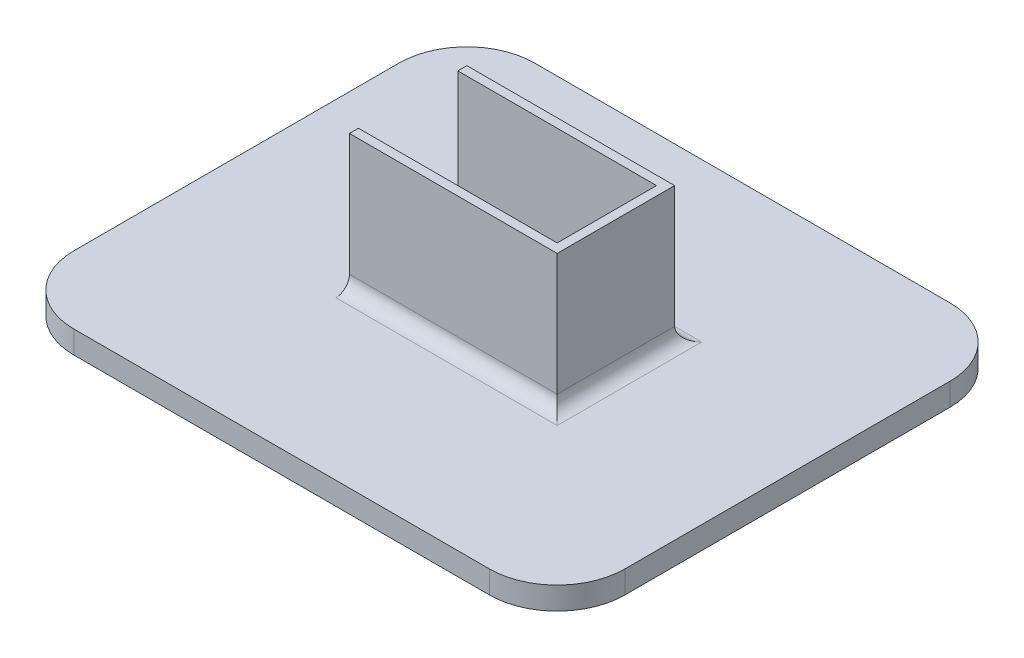
ISO-10303-21;
HEADER;
FILE_DESCRIPTION(('STEP AP214'),'2;1');
FILE_NAME('part.step','',(''),(''),'','','');
FILE_SCHEMA(('AUTOMOTIVE_DESIGN { 1 0 10303 214 1 1 1 1 }'));
ENDSEC;
DATA;
#1=APPLICATION_CONTEXT('core data for automotive mechanical design processes');
#2=APPLICATION_PROTOCOL_DEFINITION('international standard','automotive_design',2000,#1);
#3=PRODUCT_CONTEXT('',#1,'mechanical');
#4=PRODUCT('Part','Part','',(#3));
#5=PRODUCT_RELATED_PRODUCT_CATEGORY('part','',(#4));
#6=PRODUCT_DEFINITION_FORMATION('','',#4);
#7=PRODUCT_DEFINITION_CONTEXT('part definition',#1,'design');
#8=PRODUCT_DEFINITION('design','',#6,#7);
#9=PRODUCT_DEFINITION_SHAPE('','',#8);
#10=(LENGTH_UNIT() NAMED_UNIT(*) SI_UNIT(.MILLI.,.METRE.));
#11=(NAMED_UNIT(*) PLANE_ANGLE_UNIT() SI_UNIT($,.RADIAN.));
#12=(NAMED_UNIT(*) SI_UNIT($,.STERADIAN.) SOLID_ANGLE_UNIT());
#13=UNCERTAINTY_MEASURE_WITH_UNIT(LENGTH_MEASURE(1.E-05),#10,'distance_accuracy_value','');
#14=(GEOMETRIC_REPRESENTATION_CONTEXT(3) GLOBAL_UNCERTAINTY_ASSIGNED_CONTEXT((#13)) GLOBAL_UNIT_ASSIGNED_CONTEXT((#10,
#11,#12)) REPRESENTATION_CONTEXT('',''));
#15=CARTESIAN_POINT('',(0.,0.,0.));
#16=DIRECTION('',(0.,0.,1.));
#17=DIRECTION('',(1.,0.,0.));
#18=AXIS2_PLACEMENT_3D('',#15,#16,#17);
#19=CARTESIAN_POINT('',(-23.,35.,13.));
#20=DIRECTION('',(1.,0.,0.));
#21=DIRECTION('',(0.,0.,-1.));
#22=AXIS2_PLACEMENT_3D('',#19,#20,#21);
#23=PLANE('',#22);
#24=DIRECTION('',(0.,0.,1.));
#25=VECTOR('',#24,1.);
#26=CARTESIAN_POINT('',(-23.,5.,13.));
#27=LINE('',#26,#25);
#28=CARTESIAN_POINT('',(-23.,5.,-16.));
#29=VERTEX_POINT('',#28);
#30=CARTESIAN_POINT('',(-23.,5.,-11.));
#31=VERTEX_POINT('',#30);
#32=EDGE_CURVE('E201',#29,#31,#27,.T.);
#33=ORIENTED_EDGE('',*,*,#32,.T.);
#34=DIRECTION('',(0.,-1.,0.));
#35=VECTOR('',#34,1.);
#36=CARTESIAN_POINT('',(-23.,35.,-11.));
#37=LINE('',#36,#35);
#38=CARTESIAN_POINT('',(-23.,35.,-11.));
#39=VERTEX_POINT('',#38);
#40=EDGE_CURVE('E185',#39,#31,#37,.T.);
#41=ORIENTED_EDGE('',*,*,#40,.F.);
#42=DIRECTION('',(0.,0.,1.));
#43=VECTOR('',#42,1.);
#44=CARTESIAN_POINT('',(-23.,35.,13.));
#45=LINE('',#44,#43);
#46=CARTESIAN_POINT('',(-23.,35.,-13.));
#47=VERTEX_POINT('',#46);
#48=EDGE_CURVE('E211',#47,#39,#45,.T.);
#49=ORIENTED_EDGE('',*,*,#48,.F.);
#50=DIRECTION('',(0.,-1.,0.));
#51=VECTOR('',#50,1.);
#52=CARTESIAN_POINT('',(-23.,35.,-13.));
#53=LINE('',#52,#51);
#54=CARTESIAN_POINT('',(-23.,8.,-13.));
#55=VERTEX_POINT('',#54);
#56=EDGE_CURVE('E217',#47,#55,#53,.T.);
#57=ORIENTED_EDGE('',*,*,#56,.T.);
#58=CARTESIAN_POINT('',(-23.,8.,-16.));
#59=DIRECTION('',(1.,0.,0.));
#60=DIRECTION('',(0.,0.,-1.));
#61=AXIS2_PLACEMENT_3D('',#58,#59,#60);
#62=CIRCLE('',#61,3.);
#63=EDGE_CURVE('E276',#55,#29,#62,.T.);
#64=ORIENTED_EDGE('',*,*,#63,.T.);
#65=EDGE_LOOP('',(#33,#41,#49,#57,#64));
#66=FACE_BOUND('',#65,.T.);
#67=ADVANCED_FACE('F45',(#66),#23,.F.);
#68=CARTESIAN_POINT('',(-61.,5.,51.));
#69=DIRECTION('',(1.,0.,0.));
#70=DIRECTION('',(0.,0.,-1.));
#71=AXIS2_PLACEMENT_3D('',#68,#69,#70);
#72=PLANE('',#71);
#73=DIRECTION('',(0.,0.,1.));
#74=VECTOR('',#73,1.);
#75=CARTESIAN_POINT('',(-61.,5.,51.));
#76=LINE('',#75,#74);
#77=CARTESIAN_POINT('',(-61.,5.,-36.));
#78=VERTEX_POINT('',#77);
#79=CARTESIAN_POINT('',(-61.,5.,36.));
#80=VERTEX_POINT('',#79);
#81=EDGE_CURVE('E230',#78,#80,#76,.T.);
#82=ORIENTED_EDGE('',*,*,#81,.F.);
#83=DIRECTION('',(0.,-1.,0.));
#84=VECTOR('',#83,1.);
#85=CARTESIAN_POINT('',(-61.,5.,-36.));
#86=LINE('',#85,#84);
#87=CARTESIAN_POINT('',(-61.,0.,-36.));
#88=VERTEX_POINT('',#87);
#89=EDGE_CURVE('E293',#78,#88,#86,.T.);
#90=ORIENTED_EDGE('',*,*,#89,.T.);
#91=DIRECTION('',(0.,0.,1.));
#92=VECTOR('',#91,1.);
#93=CARTESIAN_POINT('',(-61.,0.,51.));
#94=LINE('',#93,#92);
#95=CARTESIAN_POINT('',(-61.,0.,36.));
#96=VERTEX_POINT('',#95);
#97=EDGE_CURVE('E229',#88,#96,#94,.T.);
#98=ORIENTED_EDGE('',*,*,#97,.T.);
#99=DIRECTION('',(0.,-1.,0.));
#100=VECTOR('',#99,1.);
#101=CARTESIAN_POINT('',(-61.,5.,36.));
#102=LINE('',#101,#100);
#103=EDGE_CURVE('E283',#96,#80,#102,.F.);
#104=ORIENTED_EDGE('',*,*,#103,.T.);
#105=EDGE_LOOP('',(#82,#90,#98,#104));
#106=FACE_BOUND('',#105,.T.);
#107=ADVANCED_FACE('F365',(#106),#72,.F.);
#108=CARTESIAN_POINT('',(-61.,5.,51.));
#109=DIRECTION('',(0.,0.,-1.));
#110=DIRECTION('',(-1.,0.,0.));
#111=AXIS2_PLACEMENT_3D('',#108,#109,#110);
#112=PLANE('',#111);
#113=DIRECTION('',(1.,0.,0.));
#114=VECTOR('',#113,1.);
#115=CARTESIAN_POINT('',(-61.,0.,51.));
#116=LINE('',#115,#114);
#117=CARTESIAN_POINT('',(-46.,0.,51.));
#118=VERTEX_POINT('',#117);
#119=CARTESIAN_POINT('',(46.,0.,51.));
#120=VERTEX_POINT('',#119);
#121=EDGE_CURVE('E249',#118,#120,#116,.T.);
#122=ORIENTED_EDGE('',*,*,#121,.T.);
#123=DIRECTION('',(0.,-1.,0.));
#124=VECTOR('',#123,1.);
#125=CARTESIAN_POINT('',(46.,5.,51.));
#126=LINE('',#125,#124);
#127=CARTESIAN_POINT('',(46.,5.,51.));
#128=VERTEX_POINT('',#127);
#129=EDGE_CURVE('E11',#120,#128,#126,.F.);
#130=ORIENTED_EDGE('',*,*,#129,.T.);
#131=DIRECTION('',(1.,0.,0.));
#132=VECTOR('',#131,1.);
#133=CARTESIAN_POINT('',(-61.,5.,51.));
#134=LINE('',#133,#132);
#135=CARTESIAN_POINT('',(-46.,5.,51.));
#136=VERTEX_POINT('',#135);
#137=EDGE_CURVE('E234',#136,#128,#134,.T.);
#138=ORIENTED_EDGE('',*,*,#137,.F.);
#139=DIRECTION('',(0.,-1.,0.));
#140=VECTOR('',#139,1.);
#141=CARTESIAN_POINT('',(-46.,5.,51.));
#142=LINE('',#141,#140);
#143=EDGE_CURVE('E54',#136,#118,#142,.T.);
#144=ORIENTED_EDGE('',*,*,#143,.T.);
#145=EDGE_LOOP('',(#122,#130,#138,#144));
#146=FACE_BOUND('',#145,.T.);
#147=ADVANCED_FACE('F338',(#146),#112,.F.);
#148=CARTESIAN_POINT('',(61.,5.,51.));
#149=DIRECTION('',(-1.,0.,0.));
#150=DIRECTION('',(0.,0.,1.));
#151=AXIS2_PLACEMENT_3D('',#148,#149,#150);
#152=PLANE('',#151);
#153=DIRECTION('',(0.,0.,-1.));
#154=VECTOR('',#153,1.);
#155=CARTESIAN_POINT('',(61.,0.,51.));
#156=LINE('',#155,#154);
#157=CARTESIAN_POINT('',(61.,0.,36.));
#158=VERTEX_POINT('',#157);
#159=CARTESIAN_POINT('',(61.,0.,-36.));
#160=VERTEX_POINT('',#159);
#161=EDGE_CURVE('E253',#158,#160,#156,.T.);
#162=ORIENTED_EDGE('',*,*,#161,.T.);
#163=DIRECTION('',(0.,-1.,0.));
#164=VECTOR('',#163,1.);
#165=CARTESIAN_POINT('',(61.,5.,-36.));
#166=LINE('',#165,#164);
#167=CARTESIAN_POINT('',(61.,5.,-36.));
#168=VERTEX_POINT('',#167);
#169=EDGE_CURVE('E61',#160,#168,#166,.F.);
#170=ORIENTED_EDGE('',*,*,#169,.T.);
#171=DIRECTION('',(0.,0.,-1.));
#172=VECTOR('',#171,1.);
#173=CARTESIAN_POINT('',(61.,5.,51.));
#174=LINE('',#173,#172);
#175=CARTESIAN_POINT('',(61.,5.,36.));
#176=VERTEX_POINT('',#175);
#177=EDGE_CURVE('E238',#176,#168,#174,.T.);
#178=ORIENTED_EDGE('',*,*,#177,.F.);
#179=DIRECTION('',(0.,-1.,0.));
#180=VECTOR('',#179,1.);
#181=CARTESIAN_POINT('',(61.,5.,36.));
#182=LINE('',#181,#180);
#183=EDGE_CURVE('E327',#176,#158,#182,.T.);
#184=ORIENTED_EDGE('',*,*,#183,.T.);
#185=EDGE_LOOP('',(#162,#170,#178,#184));
#186=FACE_BOUND('',#185,.T.);
#187=ADVANCED_FACE('F349',(#186),#152,.F.);
#188=CARTESIAN_POINT('',(-61.,5.,-51.));
#189=DIRECTION('',(0.,0.,1.));
#190=DIRECTION('',(1.,0.,0.));
#191=AXIS2_PLACEMENT_3D('',#188,#189,#190);
#192=PLANE('',#191);
#193=DIRECTION('',(-1.,0.,0.));
#194=VECTOR('',#193,1.);
#195=CARTESIAN_POINT('',(-61.,0.,-51.));
#196=LINE('',#195,#194);
#197=CARTESIAN_POINT('',(46.,0.,-51.));
#198=VERTEX_POINT('',#197);
#199=CARTESIAN_POINT('',(-46.,0.,-51.));
#200=VERTEX_POINT('',#199);
#201=EDGE_CURVE('E235',#198,#200,#196,.T.);
#202=ORIENTED_EDGE('',*,*,#201,.T.);
#203=DIRECTION('',(0.,-1.,0.));
#204=VECTOR('',#203,1.);
#205=CARTESIAN_POINT('',(-46.,5.,-51.));
#206=LINE('',#205,#204);
#207=CARTESIAN_POINT('',(-46.,5.,-51.));
#208=VERTEX_POINT('',#207);
#209=EDGE_CURVE('E313',#200,#208,#206,.F.);
#210=ORIENTED_EDGE('',*,*,#209,.T.);
#211=DIRECTION('',(-1.,0.,0.));
#212=VECTOR('',#211,1.);
#213=CARTESIAN_POINT('',(-61.,5.,-51.));
#214=LINE('',#213,#212);
#215=CARTESIAN_POINT('',(46.,5.,-51.));
#216=VERTEX_POINT('',#215);
#217=EDGE_CURVE('E241',#216,#208,#214,.T.);
#218=ORIENTED_EDGE('',*,*,#217,.F.);
#219=DIRECTION('',(0.,-1.,0.));
#220=VECTOR('',#219,1.);
#221=CARTESIAN_POINT('',(46.,5.,-51.));
#222=LINE('',#221,#220);
#223=EDGE_CURVE('E309',#216,#198,#222,.T.);
#224=ORIENTED_EDGE('',*,*,#223,.T.);
#225=EDGE_LOOP('',(#202,#210,#218,#224));
#226=FACE_BOUND('',#225,.T.);
#227=ADVANCED_FACE('F357',(#226),#192,.F.);
#228=CARTESIAN_POINT('',(0.,0.,0.));
#229=DIRECTION('',(0.,-1.,0.));
#230=DIRECTION('',(0.,0.,-1.));
#231=AXIS2_PLACEMENT_3D('',#228,#229,#230);
#232=PLANE('',#231);
#233=ORIENTED_EDGE('',*,*,#97,.F.);
#234=CARTESIAN_POINT('',(-46.,0.,-36.));
#235=DIRECTION('',(0.,-1.,0.));
#236=DIRECTION('',(0.,0.,-1.));
#237=AXIS2_PLACEMENT_3D('',#234,#235,#236);
#238=CIRCLE('',#237,15.);
#239=EDGE_CURVE('E306',#88,#200,#238,.T.);
#240=ORIENTED_EDGE('',*,*,#239,.T.);
#241=ORIENTED_EDGE('',*,*,#201,.F.);
#242=CARTESIAN_POINT('',(46.,0.,-36.));
#243=DIRECTION('',(0.,-1.,0.));
#244=DIRECTION('',(0.,0.,-1.));
#245=AXIS2_PLACEMENT_3D('',#242,#243,#244);
#246=CIRCLE('',#245,15.);
#247=EDGE_CURVE('E303',#198,#160,#246,.T.);
#248=ORIENTED_EDGE('',*,*,#247,.T.);
#249=ORIENTED_EDGE('',*,*,#161,.F.);
#250=CARTESIAN_POINT('',(46.,0.,36.));
#251=DIRECTION('',(0.,-1.,0.));
#252=DIRECTION('',(0.,0.,-1.));
#253=AXIS2_PLACEMENT_3D('',#250,#251,#252);
#254=CIRCLE('',#253,15.);
#255=EDGE_CURVE('E300',#158,#120,#254,.T.);
#256=ORIENTED_EDGE('',*,*,#255,.T.);
#257=ORIENTED_EDGE('',*,*,#121,.F.);
#258=CARTESIAN_POINT('',(-46.,0.,36.));
#259=DIRECTION('',(0.,-1.,0.));
#260=DIRECTION('',(0.,0.,-1.));
#261=AXIS2_PLACEMENT_3D('',#258,#259,#260);
#262=CIRCLE('',#261,15.);
#263=EDGE_CURVE('E297',#118,#96,#262,.T.);
#264=ORIENTED_EDGE('',*,*,#263,.T.);
#265=EDGE_LOOP('',(#233,#240,#241,#248,#249,#256,#257,#264));
#266=FACE_BOUND('',#265,.T.);
#267=ADVANCED_FACE('F344',(#266),#232,.T.);
#268=CARTESIAN_POINT('',(0.,35.,0.));
#269=DIRECTION('',(0.,1.,0.));
#270=DIRECTION('',(0.,0.,1.));
#271=AXIS2_PLACEMENT_3D('',#268,#269,#270);
#272=PLANE('',#271);
#273=ORIENTED_EDGE('',*,*,#48,.T.);
#274=DIRECTION('',(-1.,0.,0.));
#275=VECTOR('',#274,1.);
#276=CARTESIAN_POINT('',(-21.,35.,-11.));
#277=LINE('',#276,#275);
#278=CARTESIAN_POINT('',(21.,35.,-11.));
#279=VERTEX_POINT('',#278);
#280=EDGE_CURVE('E570',#279,#39,#277,.T.);
#281=ORIENTED_EDGE('',*,*,#280,.F.);
#282=DIRECTION('',(0.,0.,-1.));
#283=VECTOR('',#282,1.);
#284=CARTESIAN_POINT('',(21.,35.,11.));
#285=LINE('',#284,#283);
#286=CARTESIAN_POINT('',(21.,35.,11.));
#287=VERTEX_POINT('',#286);
#288=EDGE_CURVE('E595',#287,#279,#285,.T.);
#289=ORIENTED_EDGE('',*,*,#288,.F.);
#290=DIRECTION('',(1.,0.,0.));
#291=VECTOR('',#290,1.);
#292=CARTESIAN_POINT('',(-21.,35.,11.));
#293=LINE('',#292,#291);
#294=CARTESIAN_POINT('',(-23.,35.,11.));
#295=VERTEX_POINT('',#294);
#296=EDGE_CURVE('E590',#295,#287,#293,.T.);
#297=ORIENTED_EDGE('',*,*,#296,.F.);
#298=CARTESIAN_POINT('',(-23.,35.,13.));
#299=VERTEX_POINT('',#298);
#300=EDGE_CURVE('E192',#295,#299,#45,.T.);
#301=ORIENTED_EDGE('',*,*,#300,.T.);
#302=DIRECTION('',(1.,0.,0.));
#303=VECTOR('',#302,1.);
#304=CARTESIAN_POINT('',(-23.,35.,13.));
#305=LINE('',#304,#303);
#306=CARTESIAN_POINT('',(23.,35.,13.));
#307=VERTEX_POINT('',#306);
#308=EDGE_CURVE('E206',#299,#307,#305,.T.);
#309=ORIENTED_EDGE('',*,*,#308,.T.);
#310=DIRECTION('',(0.,0.,-1.));
#311=VECTOR('',#310,1.);
#312=CARTESIAN_POINT('',(23.,35.,13.));
#313=LINE('',#312,#311);
#314=CARTESIAN_POINT('',(23.,35.,-13.));
#315=VERTEX_POINT('',#314);
#316=EDGE_CURVE('E579',#307,#315,#313,.T.);
#317=ORIENTED_EDGE('',*,*,#316,.T.);
#318=DIRECTION('',(-1.,0.,0.));
#319=VECTOR('',#318,1.);
#320=CARTESIAN_POINT('',(-23.,35.,-13.));
#321=LINE('',#320,#319);
#322=EDGE_CURVE('E572',#315,#47,#321,.T.);
#323=ORIENTED_EDGE('',*,*,#322,.T.);
#324=EDGE_LOOP('',(#273,#281,#289,#297,#301,#309,#317,#323));
#325=FACE_BOUND('',#324,.T.);
#326=ADVANCED_FACE('F401',(#325),#272,.T.);
#327=CARTESIAN_POINT('',(-23.,35.,13.));
#328=DIRECTION('',(0.,0.,-1.));
#329=DIRECTION('',(-1.,0.,0.));
#330=AXIS2_PLACEMENT_3D('',#327,#328,#329);
#331=PLANE('',#330);
#332=DIRECTION('',(0.,-1.,0.));
#333=VECTOR('',#332,1.);
#334=CARTESIAN_POINT('',(-23.,35.,13.));
#335=LINE('',#334,#333);
#336=CARTESIAN_POINT('',(-23.,8.,13.));
#337=VERTEX_POINT('',#336);
#338=EDGE_CURVE('E213',#299,#337,#335,.T.);
#339=ORIENTED_EDGE('',*,*,#338,.T.);
#340=DIRECTION('',(1.,0.,0.));
#341=VECTOR('',#340,1.);
#342=CARTESIAN_POINT('',(23.,8.,13.));
#343=LINE('',#342,#341);
#344=CARTESIAN_POINT('',(23.,8.,13.));
#345=VERTEX_POINT('',#344);
#346=EDGE_CURVE('E273',#337,#345,#343,.T.);
#347=ORIENTED_EDGE('',*,*,#346,.T.);
#348=DIRECTION('',(0.,-1.,0.));
#349=VECTOR('',#348,1.);
#350=CARTESIAN_POINT('',(23.,35.,13.));
#351=LINE('',#350,#349);
#352=EDGE_CURVE('E225',#307,#345,#351,.T.);
#353=ORIENTED_EDGE('',*,*,#352,.F.);
#354=ORIENTED_EDGE('',*,*,#308,.F.);
#355=EDGE_LOOP('',(#339,#347,#353,#354));
#356=FACE_BOUND('',#355,.T.);
#357=ADVANCED_FACE('F396',(#356),#331,.F.);
#358=CARTESIAN_POINT('',(23.,35.,13.));
#359=DIRECTION('',(-1.,0.,0.));
#360=DIRECTION('',(0.,0.,1.));
#361=AXIS2_PLACEMENT_3D('',#358,#359,#360);
#362=PLANE('',#361);
#363=ORIENTED_EDGE('',*,*,#352,.T.);
#364=DIRECTION('',(0.,0.,-1.));
#365=VECTOR('',#364,1.);
#366=CARTESIAN_POINT('',(23.,8.,-13.));
#367=LINE('',#366,#365);
#368=CARTESIAN_POINT('',(23.,8.,-13.));
#369=VERTEX_POINT('',#368);
#370=EDGE_CURVE('E270',#345,#369,#367,.T.);
#371=ORIENTED_EDGE('',*,*,#370,.T.);
#372=DIRECTION('',(0.,-1.,0.));
#373=VECTOR('',#372,1.);
#374=CARTESIAN_POINT('',(23.,35.,-13.));
#375=LINE('',#374,#373);
#376=EDGE_CURVE('E221',#315,#369,#375,.T.);
#377=ORIENTED_EDGE('',*,*,#376,.F.);
#378=ORIENTED_EDGE('',*,*,#316,.F.);
#379=EDGE_LOOP('',(#363,#371,#377,#378));
#380=FACE_BOUND('',#379,.T.);
#381=ADVANCED_FACE('F391',(#380),#362,.F.);
#382=CARTESIAN_POINT('',(-23.,35.,-13.));
#383=DIRECTION('',(0.,0.,1.));
#384=DIRECTION('',(1.,0.,0.));
#385=AXIS2_PLACEMENT_3D('',#382,#383,#384);
#386=PLANE('',#385);
#387=ORIENTED_EDGE('',*,*,#376,.T.);
#388=DIRECTION('',(-1.,0.,0.));
#389=VECTOR('',#388,1.);
#390=CARTESIAN_POINT('',(-23.,8.,-13.));
#391=LINE('',#390,#389);
#392=EDGE_CURVE('E245',#369,#55,#391,.T.);
#393=ORIENTED_EDGE('',*,*,#392,.T.);
#394=ORIENTED_EDGE('',*,*,#56,.F.);
#395=ORIENTED_EDGE('',*,*,#322,.F.);
#396=EDGE_LOOP('',(#387,#393,#394,#395));
#397=FACE_BOUND('',#396,.T.);
#398=ADVANCED_FACE('F383',(#397),#386,.F.);
#399=ORIENTED_EDGE('',*,*,#300,.F.);
#400=DIRECTION('',(0.,1.,0.));
#401=VECTOR('',#400,1.);
#402=CARTESIAN_POINT('',(-23.,5.,11.));
#403=LINE('',#402,#401);
#404=CARTESIAN_POINT('',(-23.,5.,11.));
#405=VERTEX_POINT('',#404);
#406=EDGE_CURVE('E175',#405,#295,#403,.T.);
#407=ORIENTED_EDGE('',*,*,#406,.F.);
#408=CARTESIAN_POINT('',(-23.,5.,16.));
#409=VERTEX_POINT('',#408);
#410=EDGE_CURVE('E189',#405,#409,#27,.T.);
#411=ORIENTED_EDGE('',*,*,#410,.T.);
#412=CARTESIAN_POINT('',(-23.,8.,16.));
#413=DIRECTION('',(1.,0.,0.));
#414=DIRECTION('',(0.,0.,-1.));
#415=AXIS2_PLACEMENT_3D('',#412,#413,#414);
#416=CIRCLE('',#415,3.);
#417=EDGE_CURVE('E280',#409,#337,#416,.T.);
#418=ORIENTED_EDGE('',*,*,#417,.T.);
#419=ORIENTED_EDGE('',*,*,#338,.F.);
#420=EDGE_LOOP('',(#399,#407,#411,#418,#419));
#421=FACE_BOUND('',#420,.T.);
#422=ADVANCED_FACE('F188',(#421),#23,.F.);
#423=CARTESIAN_POINT('',(-21.,35.,11.));
#424=DIRECTION('',(0.,0.,-1.));
#425=DIRECTION('',(-1.,0.,0.));
#426=AXIS2_PLACEMENT_3D('',#423,#424,#425);
#427=PLANE('',#426);
#428=DIRECTION('',(1.,0.,0.));
#429=VECTOR('',#428,1.);
#430=CARTESIAN_POINT('',(-21.,5.,11.));
#431=LINE('',#430,#429);
#432=CARTESIAN_POINT('',(21.,5.,11.));
#433=VERTEX_POINT('',#432);
#434=EDGE_CURVE('E172',#405,#433,#431,.T.);
#435=ORIENTED_EDGE('',*,*,#434,.F.);
#436=ORIENTED_EDGE('',*,*,#406,.T.);
#437=ORIENTED_EDGE('',*,*,#296,.T.);
#438=DIRECTION('',(0.,-1.,0.));
#439=VECTOR('',#438,1.);
#440=CARTESIAN_POINT('',(21.,35.,11.));
#441=LINE('',#440,#439);
#442=EDGE_CURVE('E178',#287,#433,#441,.T.);
#443=ORIENTED_EDGE('',*,*,#442,.T.);
#444=EDGE_LOOP('',(#435,#436,#437,#443));
#445=FACE_BOUND('',#444,.T.);
#446=ADVANCED_FACE('F174',(#445),#427,.T.);
#447=CARTESIAN_POINT('',(21.,35.,11.));
#448=DIRECTION('',(-1.,0.,0.));
#449=DIRECTION('',(0.,0.,1.));
#450=AXIS2_PLACEMENT_3D('',#447,#448,#449);
#451=PLANE('',#450);
#452=DIRECTION('',(0.,0.,-1.));
#453=VECTOR('',#452,1.);
#454=CARTESIAN_POINT('',(21.,5.,11.));
#455=LINE('',#454,#453);
#456=CARTESIAN_POINT('',(21.,5.,-11.));
#457=VERTEX_POINT('',#456);
#458=EDGE_CURVE('E184',#433,#457,#455,.T.);
#459=ORIENTED_EDGE('',*,*,#458,.F.);
#460=ORIENTED_EDGE('',*,*,#442,.F.);
#461=ORIENTED_EDGE('',*,*,#288,.T.);
#462=DIRECTION('',(0.,-1.,0.));
#463=VECTOR('',#462,1.);
#464=CARTESIAN_POINT('',(21.,35.,-11.));
#465=LINE('',#464,#463);
#466=EDGE_CURVE('E207',#279,#457,#465,.T.);
#467=ORIENTED_EDGE('',*,*,#466,.T.);
#468=EDGE_LOOP('',(#459,#460,#461,#467));
#469=FACE_BOUND('',#468,.T.);
#470=ADVANCED_FACE('F389',(#469),#451,.T.);
#471=CARTESIAN_POINT('',(-21.,35.,-11.));
#472=DIRECTION('',(0.,0.,1.));
#473=DIRECTION('',(1.,0.,0.));
#474=AXIS2_PLACEMENT_3D('',#471,#472,#473);
#475=PLANE('',#474);
#476=DIRECTION('',(-1.,0.,0.));
#477=VECTOR('',#476,1.);
#478=CARTESIAN_POINT('',(-21.,5.,-11.));
#479=LINE('',#478,#477);
#480=EDGE_CURVE('E587',#457,#31,#479,.T.);
#481=ORIENTED_EDGE('',*,*,#480,.F.);
#482=ORIENTED_EDGE('',*,*,#466,.F.);
#483=ORIENTED_EDGE('',*,*,#280,.T.);
#484=ORIENTED_EDGE('',*,*,#40,.T.);
#485=EDGE_LOOP('',(#481,#482,#483,#484));
#486=FACE_BOUND('',#485,.T.);
#487=ADVANCED_FACE('F406',(#486),#475,.T.);
#488=CARTESIAN_POINT('',(0.,5.,0.));
#489=DIRECTION('',(0.,-1.,0.));
#490=DIRECTION('',(0.,0.,-1.));
#491=AXIS2_PLACEMENT_3D('',#488,#489,#490);
#492=PLANE('',#491);
#493=ORIENTED_EDGE('',*,*,#32,.F.);
#494=DIRECTION('',(-1.,0.,0.));
#495=VECTOR('',#494,1.);
#496=CARTESIAN_POINT('',(23.,5.,-16.));
#497=LINE('',#496,#495);
#498=CARTESIAN_POINT('',(26.,5.,-16.));
#499=VERTEX_POINT('',#498);
#500=EDGE_CURVE('E267',#29,#499,#497,.F.);
#501=ORIENTED_EDGE('',*,*,#500,.T.);
#502=DIRECTION('',(0.,0.,-1.));
#503=VECTOR('',#502,1.);
#504=CARTESIAN_POINT('',(26.,5.,13.));
#505=LINE('',#504,#503);
#506=CARTESIAN_POINT('',(26.,5.,16.));
#507=VERTEX_POINT('',#506);
#508=EDGE_CURVE('E264',#499,#507,#505,.F.);
#509=ORIENTED_EDGE('',*,*,#508,.T.);
#510=DIRECTION('',(1.,0.,0.));
#511=VECTOR('',#510,1.);
#512=CARTESIAN_POINT('',(-23.,5.,16.));
#513=LINE('',#512,#511);
#514=EDGE_CURVE('E198',#507,#409,#513,.F.);
#515=ORIENTED_EDGE('',*,*,#514,.T.);
#516=ORIENTED_EDGE('',*,*,#410,.F.);
#517=ORIENTED_EDGE('',*,*,#434,.T.);
#518=ORIENTED_EDGE('',*,*,#458,.T.);
#519=ORIENTED_EDGE('',*,*,#480,.T.);
#520=EDGE_LOOP('',(#493,#501,#509,#515,#516,#517,#518,#519));
#521=FACE_BOUND('',#520,.T.);
#522=ORIENTED_EDGE('',*,*,#217,.T.);
#523=CARTESIAN_POINT('',(-46.,5.,-36.));
#524=DIRECTION('',(0.,-1.,0.));
#525=DIRECTION('',(0.,0.,-1.));
#526=AXIS2_PLACEMENT_3D('',#523,#524,#525);
#527=CIRCLE('',#526,15.);
#528=EDGE_CURVE('E324',#208,#78,#527,.F.);
#529=ORIENTED_EDGE('',*,*,#528,.T.);
#530=ORIENTED_EDGE('',*,*,#81,.T.);
#531=CARTESIAN_POINT('',(-46.,5.,36.));
#532=DIRECTION('',(0.,-1.,0.));
#533=DIRECTION('',(0.,0.,-1.));
#534=AXIS2_PLACEMENT_3D('',#531,#532,#533);
#535=CIRCLE('',#534,15.);
#536=EDGE_CURVE('E316',#80,#136,#535,.F.);
#537=ORIENTED_EDGE('',*,*,#536,.T.);
#538=ORIENTED_EDGE('',*,*,#137,.T.);
#539=CARTESIAN_POINT('',(46.,5.,36.));
#540=DIRECTION('',(0.,-1.,0.));
#541=DIRECTION('',(0.,0.,-1.));
#542=AXIS2_PLACEMENT_3D('',#539,#540,#541);
#543=CIRCLE('',#542,15.);
#544=EDGE_CURVE('E68',#128,#176,#543,.F.);
#545=ORIENTED_EDGE('',*,*,#544,.T.);
#546=ORIENTED_EDGE('',*,*,#177,.T.);
#547=CARTESIAN_POINT('',(46.,5.,-36.));
#548=DIRECTION('',(0.,-1.,0.));
#549=DIRECTION('',(0.,0.,-1.));
#550=AXIS2_PLACEMENT_3D('',#547,#548,#549);
#551=CIRCLE('',#550,15.);
#552=EDGE_CURVE('E321',#168,#216,#551,.F.);
#553=ORIENTED_EDGE('',*,*,#552,.T.);
#554=EDGE_LOOP('',(#522,#529,#530,#537,#538,#545,#546,#553));
#555=FACE_BOUND('',#554,.T.);
#556=ADVANCED_FACE('F196',(#521,#555),#492,.F.);
#557=CARTESIAN_POINT('',(-23.,8.,16.));
#558=DIRECTION('',(-1.,0.,0.));
#559=DIRECTION('',(0.,0.,1.));
#560=AXIS2_PLACEMENT_3D('',#557,#558,#559);
#561=CYLINDRICAL_SURFACE('',#560,3.);
#562=ORIENTED_EDGE('',*,*,#417,.F.);
#563=ORIENTED_EDGE('',*,*,#514,.F.);
#564=CARTESIAN_POINT('',(26.,8.,16.));
#565=DIRECTION('',(-0.707106781186547,0.,0.707106781186547));
#566=DIRECTION('',(-0.707106781186547,0.,-0.707106781186547));
#567=AXIS2_PLACEMENT_3D('',#564,#565,#566);
#568=ELLIPSE('',#567,4.24264068711928,3.);
#569=EDGE_CURVE('E194',#345,#507,#568,.T.);
#570=ORIENTED_EDGE('',*,*,#569,.F.);
#571=ORIENTED_EDGE('',*,*,#346,.F.);
#572=EDGE_LOOP('',(#562,#563,#570,#571));
#573=FACE_BOUND('',#572,.T.);
#574=ADVANCED_FACE('F405',(#573),#561,.F.);
#575=CARTESIAN_POINT('',(26.,8.,13.));
#576=DIRECTION('',(0.,0.,1.));
#577=DIRECTION('',(1.,0.,0.));
#578=AXIS2_PLACEMENT_3D('',#575,#576,#577);
#579=CYLINDRICAL_SURFACE('',#578,3.);
#580=ORIENTED_EDGE('',*,*,#569,.T.);
#581=ORIENTED_EDGE('',*,*,#508,.F.);
#582=CARTESIAN_POINT('',(26.,8.,-16.));
#583=DIRECTION('',(0.707106781186547,0.,0.707106781186547));
#584=DIRECTION('',(-0.707106781186547,0.,0.707106781186547));
#585=AXIS2_PLACEMENT_3D('',#582,#583,#584);
#586=ELLIPSE('',#585,4.24264068711928,3.);
#587=EDGE_CURVE('E284',#369,#499,#586,.T.);
#588=ORIENTED_EDGE('',*,*,#587,.F.);
#589=ORIENTED_EDGE('',*,*,#370,.F.);
#590=EDGE_LOOP('',(#580,#581,#588,#589));
#591=FACE_BOUND('',#590,.T.);
#592=ADVANCED_FACE('F418',(#591),#579,.F.);
#593=CARTESIAN_POINT('',(-23.,8.,-16.));
#594=DIRECTION('',(1.,0.,0.));
#595=DIRECTION('',(0.,0.,-1.));
#596=AXIS2_PLACEMENT_3D('',#593,#594,#595);
#597=CYLINDRICAL_SURFACE('',#596,3.);
#598=ORIENTED_EDGE('',*,*,#587,.T.);
#599=ORIENTED_EDGE('',*,*,#500,.F.);
#600=ORIENTED_EDGE('',*,*,#63,.F.);
#601=ORIENTED_EDGE('',*,*,#392,.F.);
#602=EDGE_LOOP('',(#598,#599,#600,#601));
#603=FACE_BOUND('',#602,.T.);
#604=ADVANCED_FACE('F415',(#603),#597,.F.);
#605=CARTESIAN_POINT('',(-46.,5.,-36.));
#606=DIRECTION('',(0.,-1.,0.));
#607=DIRECTION('',(0.,0.,-1.));
#608=AXIS2_PLACEMENT_3D('',#605,#606,#607);
#609=CYLINDRICAL_SURFACE('',#608,15.);
#610=ORIENTED_EDGE('',*,*,#528,.F.);
#611=ORIENTED_EDGE('',*,*,#209,.F.);
#612=ORIENTED_EDGE('',*,*,#239,.F.);
#613=ORIENTED_EDGE('',*,*,#89,.F.);
#614=EDGE_LOOP('',(#610,#611,#612,#613));
#615=FACE_BOUND('',#614,.T.);
#616=ADVANCED_FACE('F362',(#615),#609,.T.);
#617=CARTESIAN_POINT('',(46.,5.,-36.));
#618=DIRECTION('',(0.,-1.,0.));
#619=DIRECTION('',(0.,0.,-1.));
#620=AXIS2_PLACEMENT_3D('',#617,#618,#619);
#621=CYLINDRICAL_SURFACE('',#620,15.);
#622=ORIENTED_EDGE('',*,*,#552,.F.);
#623=ORIENTED_EDGE('',*,*,#169,.F.);
#624=ORIENTED_EDGE('',*,*,#247,.F.);
#625=ORIENTED_EDGE('',*,*,#223,.F.);
#626=EDGE_LOOP('',(#622,#623,#624,#625));
#627=FACE_BOUND('',#626,.T.);
#628=ADVANCED_FACE('F354',(#627),#621,.T.);
#629=CARTESIAN_POINT('',(46.,5.,36.));
#630=DIRECTION('',(0.,-1.,0.));
#631=DIRECTION('',(0.,0.,-1.));
#632=AXIS2_PLACEMENT_3D('',#629,#630,#631);
#633=CYLINDRICAL_SURFACE('',#632,15.);
#634=ORIENTED_EDGE('',*,*,#544,.F.);
#635=ORIENTED_EDGE('',*,*,#129,.F.);
#636=ORIENTED_EDGE('',*,*,#255,.F.);
#637=ORIENTED_EDGE('',*,*,#183,.F.);
#638=EDGE_LOOP('',(#634,#635,#636,#637));
#639=FACE_BOUND('',#638,.T.);
#640=ADVANCED_FACE('F348',(#639),#633,.T.);
#641=CARTESIAN_POINT('',(-46.,5.,36.));
#642=DIRECTION('',(0.,-1.,0.));
#643=DIRECTION('',(0.,0.,-1.));
#644=AXIS2_PLACEMENT_3D('',#641,#642,#643);
#645=CYLINDRICAL_SURFACE('',#644,15.);
#646=ORIENTED_EDGE('',*,*,#536,.F.);
#647=ORIENTED_EDGE('',*,*,#103,.F.);
#648=ORIENTED_EDGE('',*,*,#263,.F.);
#649=ORIENTED_EDGE('',*,*,#143,.F.);
#650=EDGE_LOOP('',(#646,#647,#648,#649));
#651=FACE_BOUND('',#650,.T.);
#652=ADVANCED_FACE('F47',(#651),#645,.T.);
#653=CLOSED_SHELL('',(#67,#107,#147,#187,#227,#267,#326,#357,#381,#398,#422,#446,#470,#487,#556,
#574,#592,#604,#616,#628,#640,#652));
#654=MANIFOLD_SOLID_BREP('B2',#653);
#655=ADVANCED_BREP_SHAPE_REPRESENTATION('',(#18,#654),#14);
#656=SHAPE_DEFINITION_REPRESENTATION(#9,#655);
ENDSEC;
END-ISO-10303-21;
